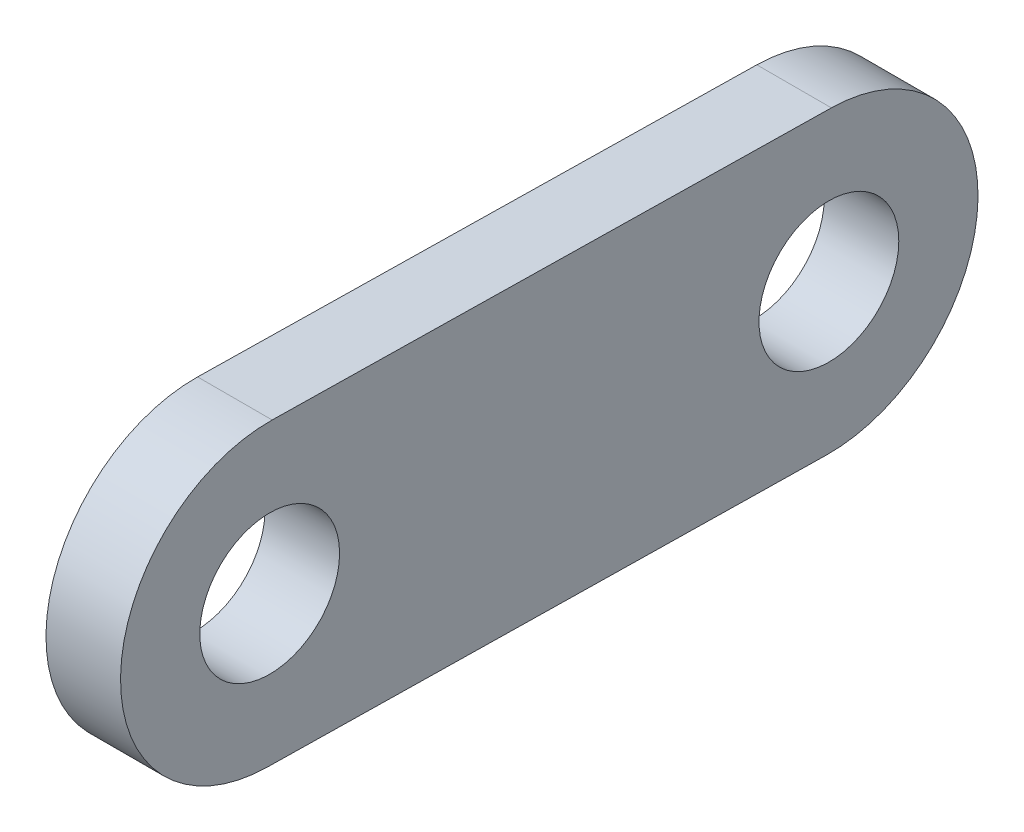
ISO-10303-21;
HEADER;
FILE_DESCRIPTION(('STEP AP214'),'2;1');
FILE_NAME('part.step','',(''),(''),'','','');
FILE_SCHEMA(('AUTOMOTIVE_DESIGN { 1 0 10303 214 1 1 1 1 }'));
ENDSEC;
DATA;
#1=APPLICATION_CONTEXT('core data for automotive mechanical design processes');
#2=APPLICATION_PROTOCOL_DEFINITION('international standard','automotive_design',2000,#1);
#3=PRODUCT_CONTEXT('',#1,'mechanical');
#4=PRODUCT('Part','Part','',(#3));
#5=PRODUCT_RELATED_PRODUCT_CATEGORY('part','',(#4));
#6=PRODUCT_DEFINITION_FORMATION('','',#4);
#7=PRODUCT_DEFINITION_CONTEXT('part definition',#1,'design');
#8=PRODUCT_DEFINITION('design','',#6,#7);
#9=PRODUCT_DEFINITION_SHAPE('','',#8);
#10=(LENGTH_UNIT() NAMED_UNIT(*) SI_UNIT(.MILLI.,.METRE.));
#11=(NAMED_UNIT(*) PLANE_ANGLE_UNIT() SI_UNIT($,.RADIAN.));
#12=(NAMED_UNIT(*) SI_UNIT($,.STERADIAN.) SOLID_ANGLE_UNIT());
#13=UNCERTAINTY_MEASURE_WITH_UNIT(LENGTH_MEASURE(1.E-05),#10,'distance_accuracy_value','');
#14=(GEOMETRIC_REPRESENTATION_CONTEXT(3) GLOBAL_UNCERTAINTY_ASSIGNED_CONTEXT((#13)) GLOBAL_UNIT_ASSIGNED_CONTEXT((#10,
#11,#12)) REPRESENTATION_CONTEXT('',''));
#15=CARTESIAN_POINT('',(0.,0.,0.));
#16=DIRECTION('',(0.,0.,1.));
#17=DIRECTION('',(1.,0.,0.));
#18=AXIS2_PLACEMENT_3D('',#15,#16,#17);
#19=CARTESIAN_POINT('',(50.,0.,0.));
#20=DIRECTION('',(1.,0.,0.));
#21=DIRECTION('',(0.,0.,-1.));
#22=AXIS2_PLACEMENT_3D('',#19,#20,#21);
#23=PLANE('',#22);
#24=CARTESIAN_POINT('',(50.,0.,0.));
#25=DIRECTION('',(1.,0.,0.));
#26=DIRECTION('',(0.,0.,-1.));
#27=AXIS2_PLACEMENT_3D('',#24,#25,#26);
#28=CIRCLE('',#27,46.875);
#29=CARTESIAN_POINT('',(50.,0.,-46.875));
#30=VERTEX_POINT('',#29);
#31=EDGE_CURVE('E102',#30,#30,#28,.T.);
#32=ORIENTED_EDGE('',*,*,#31,.F.);
#33=EDGE_LOOP('',(#32));
#34=FACE_BOUND('',#33,.T.);
#35=CARTESIAN_POINT('',(50.,0.,0.));
#36=DIRECTION('',(1.,0.,0.));
#37=DIRECTION('',(0.,0.,-1.));
#38=AXIS2_PLACEMENT_3D('',#35,#36,#37);
#39=CIRCLE('',#38,100.);
#40=CARTESIAN_POINT('',(50.,99.98611400396,-1.66643523339933));
#41=VERTEX_POINT('',#40);
#42=CARTESIAN_POINT('',(50.,-99.98611400396,1.66643523339933));
#43=VERTEX_POINT('',#42);
#44=EDGE_CURVE('E87',#41,#43,#39,.T.);
#45=ORIENTED_EDGE('',*,*,#44,.T.);
#46=DIRECTION('',(0.,-0.0166643523339935,-0.9998611400396));
#47=VECTOR('',#46,1.);
#48=CARTESIAN_POINT('',(50.,-99.98611400396,1.66643523339933));
#49=LINE('',#48,#47);
#50=CARTESIAN_POINT('',(50.,-106.23611400396,-373.333564766601));
#51=VERTEX_POINT('',#50);
#52=EDGE_CURVE('E82',#43,#51,#49,.T.);
#53=ORIENTED_EDGE('',*,*,#52,.T.);
#54=CARTESIAN_POINT('',(50.,-6.25,-375.));
#55=DIRECTION('',(1.,0.,0.));
#56=DIRECTION('',(0.,0.,-1.));
#57=AXIS2_PLACEMENT_3D('',#54,#55,#56);
#58=CIRCLE('',#57,100.);
#59=CARTESIAN_POINT('',(50.,93.73611400396,-376.666435233399));
#60=VERTEX_POINT('',#59);
#61=EDGE_CURVE('E85',#51,#60,#58,.T.);
#62=ORIENTED_EDGE('',*,*,#61,.T.);
#63=DIRECTION('',(0.,0.0166643523339933,0.9998611400396));
#64=VECTOR('',#63,1.);
#65=CARTESIAN_POINT('',(50.,99.98611400396,-1.66643523339933));
#66=LINE('',#65,#64);
#67=EDGE_CURVE('E52',#60,#41,#66,.T.);
#68=ORIENTED_EDGE('',*,*,#67,.T.);
#69=EDGE_LOOP('',(#45,#53,#62,#68));
#70=FACE_BOUND('',#69,.T.);
#71=CARTESIAN_POINT('',(50.,-6.25,-375.));
#72=DIRECTION('',(1.,0.,0.));
#73=DIRECTION('',(0.,0.,-1.));
#74=AXIS2_PLACEMENT_3D('',#71,#72,#73);
#75=CIRCLE('',#74,46.875);
#76=CARTESIAN_POINT('',(50.,-6.25,-421.875));
#77=VERTEX_POINT('',#76);
#78=EDGE_CURVE('E117',#77,#77,#75,.T.);
#79=ORIENTED_EDGE('',*,*,#78,.F.);
#80=EDGE_LOOP('',(#79));
#81=FACE_BOUND('',#80,.T.);
#82=ADVANCED_FACE('F35',(#34,#70,#81),#23,.T.);
#83=CARTESIAN_POINT('',(0.,0.,0.));
#84=DIRECTION('',(1.,0.,0.));
#85=DIRECTION('',(0.,0.,-1.));
#86=AXIS2_PLACEMENT_3D('',#83,#84,#85);
#87=PLANE('',#86);
#88=CARTESIAN_POINT('',(0.,0.,0.));
#89=DIRECTION('',(1.,0.,0.));
#90=DIRECTION('',(0.,0.,-1.));
#91=AXIS2_PLACEMENT_3D('',#88,#89,#90);
#92=CIRCLE('',#91,46.875);
#93=CARTESIAN_POINT('',(0.,0.,-46.875));
#94=VERTEX_POINT('',#93);
#95=EDGE_CURVE('E114',#94,#94,#92,.T.);
#96=ORIENTED_EDGE('',*,*,#95,.T.);
#97=EDGE_LOOP('',(#96));
#98=FACE_BOUND('',#97,.T.);
#99=CARTESIAN_POINT('',(0.,0.,0.));
#100=DIRECTION('',(1.,0.,0.));
#101=DIRECTION('',(0.,0.,-1.));
#102=AXIS2_PLACEMENT_3D('',#99,#100,#101);
#103=CIRCLE('',#102,100.);
#104=CARTESIAN_POINT('',(0.,99.98611400396,-1.66643523339933));
#105=VERTEX_POINT('',#104);
#106=CARTESIAN_POINT('',(0.,-99.98611400396,1.66643523339933));
#107=VERTEX_POINT('',#106);
#108=EDGE_CURVE('E99',#105,#107,#103,.T.);
#109=ORIENTED_EDGE('',*,*,#108,.F.);
#110=DIRECTION('',(0.,0.0166643523339933,0.9998611400396));
#111=VECTOR('',#110,1.);
#112=CARTESIAN_POINT('',(0.,99.98611400396,-1.66643523339933));
#113=LINE('',#112,#111);
#114=CARTESIAN_POINT('',(0.,93.73611400396,-376.666435233399));
#115=VERTEX_POINT('',#114);
#116=EDGE_CURVE('E75',#115,#105,#113,.T.);
#117=ORIENTED_EDGE('',*,*,#116,.F.);
#118=CARTESIAN_POINT('',(0.,-6.25,-375.));
#119=DIRECTION('',(1.,0.,0.));
#120=DIRECTION('',(0.,0.,-1.));
#121=AXIS2_PLACEMENT_3D('',#118,#119,#120);
#122=CIRCLE('',#121,100.);
#123=CARTESIAN_POINT('',(0.,-106.23611400396,-373.333564766601));
#124=VERTEX_POINT('',#123);
#125=EDGE_CURVE('E69',#124,#115,#122,.T.);
#126=ORIENTED_EDGE('',*,*,#125,.F.);
#127=DIRECTION('',(0.,-0.0166643523339935,-0.9998611400396));
#128=VECTOR('',#127,1.);
#129=CARTESIAN_POINT('',(0.,-99.98611400396,1.66643523339933));
#130=LINE('',#129,#128);
#131=EDGE_CURVE('E91',#107,#124,#130,.T.);
#132=ORIENTED_EDGE('',*,*,#131,.F.);
#133=EDGE_LOOP('',(#109,#117,#126,#132));
#134=FACE_BOUND('',#133,.T.);
#135=CARTESIAN_POINT('',(0.,-6.25,-375.));
#136=DIRECTION('',(1.,0.,0.));
#137=DIRECTION('',(0.,0.,-1.));
#138=AXIS2_PLACEMENT_3D('',#135,#136,#137);
#139=CIRCLE('',#138,46.875);
#140=CARTESIAN_POINT('',(0.,-6.25,-421.875));
#141=VERTEX_POINT('',#140);
#142=EDGE_CURVE('E120',#141,#141,#139,.T.);
#143=ORIENTED_EDGE('',*,*,#142,.T.);
#144=EDGE_LOOP('',(#143));
#145=FACE_BOUND('',#144,.T.);
#146=ADVANCED_FACE('F110',(#98,#134,#145),#87,.F.);
#147=CARTESIAN_POINT('',(50.,0.,0.));
#148=DIRECTION('',(-1.,0.,0.));
#149=DIRECTION('',(0.,0.,1.));
#150=AXIS2_PLACEMENT_3D('',#147,#148,#149);
#151=CYLINDRICAL_SURFACE('',#150,100.);
#152=ORIENTED_EDGE('',*,*,#108,.T.);
#153=DIRECTION('',(-1.,0.,0.));
#154=VECTOR('',#153,1.);
#155=CARTESIAN_POINT('',(50.,-99.98611400396,1.66643523339933));
#156=LINE('',#155,#154);
#157=EDGE_CURVE('E11',#43,#107,#156,.T.);
#158=ORIENTED_EDGE('',*,*,#157,.F.);
#159=ORIENTED_EDGE('',*,*,#44,.F.);
#160=DIRECTION('',(-1.,0.,0.));
#161=VECTOR('',#160,1.);
#162=CARTESIAN_POINT('',(50.,99.98611400396,-1.66643523339933));
#163=LINE('',#162,#161);
#164=EDGE_CURVE('E95',#41,#105,#163,.T.);
#165=ORIENTED_EDGE('',*,*,#164,.T.);
#166=EDGE_LOOP('',(#152,#158,#159,#165));
#167=FACE_BOUND('',#166,.T.);
#168=ADVANCED_FACE('F37',(#167),#151,.T.);
#169=CARTESIAN_POINT('',(50.,-99.98611400396,1.66643523339933));
#170=DIRECTION('',(0.,0.9998611400396,-0.0166643523339935));
#171=DIRECTION('',(0.,0.0166643523339935,0.9998611400396));
#172=AXIS2_PLACEMENT_3D('',#169,#170,#171);
#173=PLANE('',#172);
#174=ORIENTED_EDGE('',*,*,#131,.T.);
#175=DIRECTION('',(-1.,0.,0.));
#176=VECTOR('',#175,1.);
#177=CARTESIAN_POINT('',(50.,-106.23611400396,-373.333564766601));
#178=LINE('',#177,#176);
#179=EDGE_CURVE('E44',#51,#124,#178,.T.);
#180=ORIENTED_EDGE('',*,*,#179,.F.);
#181=ORIENTED_EDGE('',*,*,#52,.F.);
#182=ORIENTED_EDGE('',*,*,#157,.T.);
#183=EDGE_LOOP('',(#174,#180,#181,#182));
#184=FACE_BOUND('',#183,.T.);
#185=ADVANCED_FACE('F90',(#184),#173,.F.);
#186=CARTESIAN_POINT('',(50.,-6.25,-375.));
#187=DIRECTION('',(-1.,0.,0.));
#188=DIRECTION('',(0.,0.,1.));
#189=AXIS2_PLACEMENT_3D('',#186,#187,#188);
#190=CYLINDRICAL_SURFACE('',#189,100.);
#191=ORIENTED_EDGE('',*,*,#125,.T.);
#192=DIRECTION('',(-1.,0.,0.));
#193=VECTOR('',#192,1.);
#194=CARTESIAN_POINT('',(50.,93.73611400396,-376.666435233399));
#195=LINE('',#194,#193);
#196=EDGE_CURVE('E92',#60,#115,#195,.T.);
#197=ORIENTED_EDGE('',*,*,#196,.F.);
#198=ORIENTED_EDGE('',*,*,#61,.F.);
#199=ORIENTED_EDGE('',*,*,#179,.T.);
#200=EDGE_LOOP('',(#191,#197,#198,#199));
#201=FACE_BOUND('',#200,.T.);
#202=ADVANCED_FACE('F93',(#201),#190,.T.);
#203=CARTESIAN_POINT('',(50.,99.98611400396,-1.66643523339933));
#204=DIRECTION('',(0.,-0.9998611400396,0.0166643523339933));
#205=DIRECTION('',(0.,-0.0166643523339933,-0.9998611400396));
#206=AXIS2_PLACEMENT_3D('',#203,#204,#205);
#207=PLANE('',#206);
#208=ORIENTED_EDGE('',*,*,#116,.T.);
#209=ORIENTED_EDGE('',*,*,#164,.F.);
#210=ORIENTED_EDGE('',*,*,#67,.F.);
#211=ORIENTED_EDGE('',*,*,#196,.T.);
#212=EDGE_LOOP('',(#208,#209,#210,#211));
#213=FACE_BOUND('',#212,.T.);
#214=ADVANCED_FACE('F107',(#213),#207,.F.);
#215=CARTESIAN_POINT('',(50.,0.,0.));
#216=DIRECTION('',(-1.,0.,0.));
#217=DIRECTION('',(0.,0.,1.));
#218=AXIS2_PLACEMENT_3D('',#215,#216,#217);
#219=CYLINDRICAL_SURFACE('',#218,46.875);
#220=ORIENTED_EDGE('',*,*,#31,.T.);
#221=EDGE_LOOP('',(#220));
#222=FACE_BOUND('',#221,.T.);
#223=ORIENTED_EDGE('',*,*,#95,.F.);
#224=EDGE_LOOP('',(#223));
#225=FACE_BOUND('',#224,.T.);
#226=ADVANCED_FACE('F138',(#222,#225),#219,.F.);
#227=CARTESIAN_POINT('',(50.,-6.25,-375.));
#228=DIRECTION('',(-1.,0.,0.));
#229=DIRECTION('',(0.,0.,1.));
#230=AXIS2_PLACEMENT_3D('',#227,#228,#229);
#231=CYLINDRICAL_SURFACE('',#230,46.875);
#232=ORIENTED_EDGE('',*,*,#78,.T.);
#233=EDGE_LOOP('',(#232));
#234=FACE_BOUND('',#233,.T.);
#235=ORIENTED_EDGE('',*,*,#142,.F.);
#236=EDGE_LOOP('',(#235));
#237=FACE_BOUND('',#236,.T.);
#238=ADVANCED_FACE('F126',(#234,#237),#231,.F.);
#239=CLOSED_SHELL('',(#82,#146,#168,#185,#202,#214,#226,#238));
#240=MANIFOLD_SOLID_BREP('B2',#239);
#241=ADVANCED_BREP_SHAPE_REPRESENTATION('',(#18,#240),#14);
#242=SHAPE_DEFINITION_REPRESENTATION(#9,#241);
ENDSEC;
END-ISO-10303-21;
